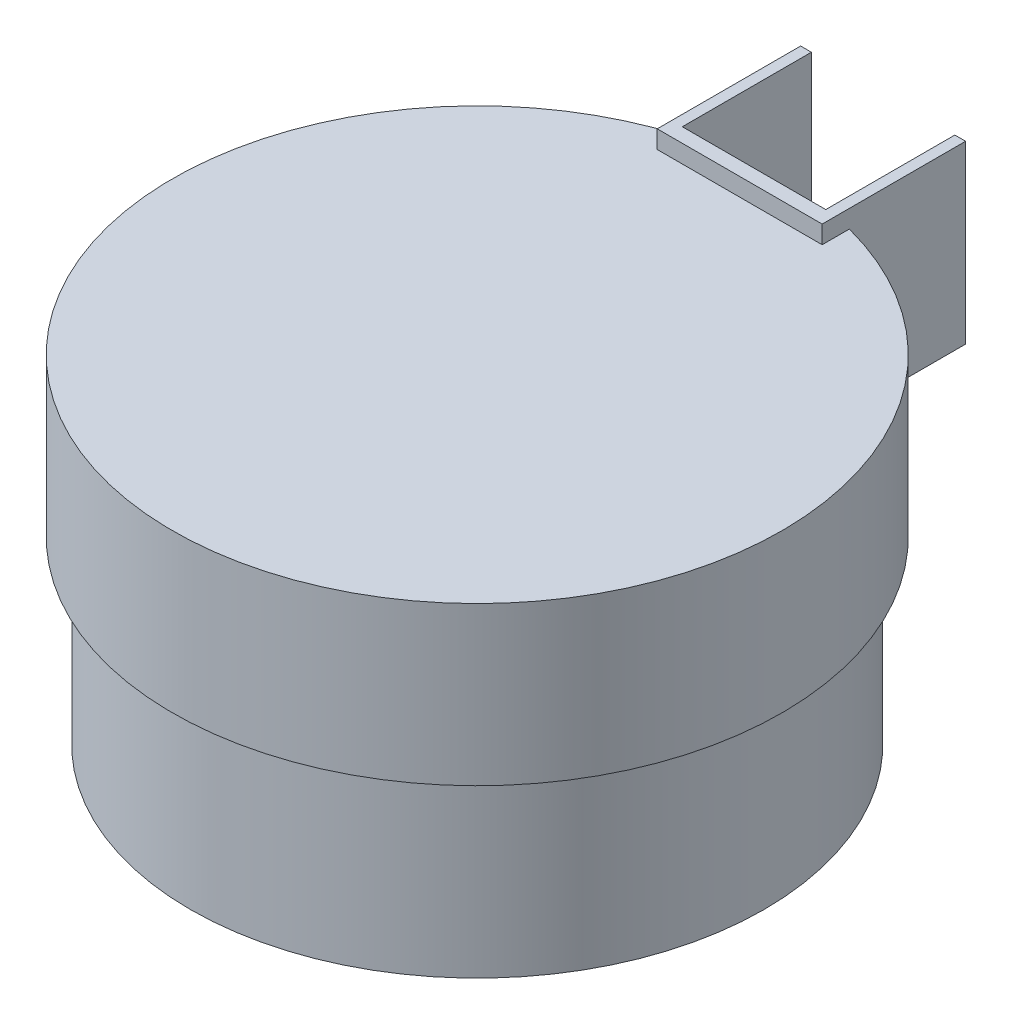
ISO-10303-21;
HEADER;
FILE_DESCRIPTION(('STEP AP214'),'2;1');
FILE_NAME('part.step','',(''),(''),'','','');
FILE_SCHEMA(('AUTOMOTIVE_DESIGN { 1 0 10303 214 1 1 1 1 }'));
ENDSEC;
DATA;
#1=APPLICATION_CONTEXT('core data for automotive mechanical design processes');
#2=APPLICATION_PROTOCOL_DEFINITION('international standard','automotive_design',2000,#1);
#3=PRODUCT_CONTEXT('',#1,'mechanical');
#4=PRODUCT('Part','Part','',(#3));
#5=PRODUCT_RELATED_PRODUCT_CATEGORY('part','',(#4));
#6=PRODUCT_DEFINITION_FORMATION('','',#4);
#7=PRODUCT_DEFINITION_CONTEXT('part definition',#1,'design');
#8=PRODUCT_DEFINITION('design','',#6,#7);
#9=PRODUCT_DEFINITION_SHAPE('','',#8);
#10=(LENGTH_UNIT() NAMED_UNIT(*) SI_UNIT(.MILLI.,.METRE.));
#11=(NAMED_UNIT(*) PLANE_ANGLE_UNIT() SI_UNIT($,.RADIAN.));
#12=(NAMED_UNIT(*) SI_UNIT($,.STERADIAN.) SOLID_ANGLE_UNIT());
#13=UNCERTAINTY_MEASURE_WITH_UNIT(LENGTH_MEASURE(1.E-05),#10,'distance_accuracy_value','');
#14=(GEOMETRIC_REPRESENTATION_CONTEXT(3) GLOBAL_UNCERTAINTY_ASSIGNED_CONTEXT((#13)) GLOBAL_UNIT_ASSIGNED_CONTEXT((#10,
#11,#12)) REPRESENTATION_CONTEXT('',''));
#15=CARTESIAN_POINT('',(0.,0.,0.));
#16=DIRECTION('',(0.,0.,1.));
#17=DIRECTION('',(1.,0.,0.));
#18=AXIS2_PLACEMENT_3D('',#15,#16,#17);
#19=CARTESIAN_POINT('',(10.7705306910649,69.,-57.3248068802023));
#20=DIRECTION('',(0.,0.,1.));
#21=DIRECTION('',(1.,0.,0.));
#22=AXIS2_PLACEMENT_3D('',#19,#20,#21);
#23=PLANE('',#22);
#24=DIRECTION('',(-1.,0.,0.));
#25=VECTOR('',#24,1.);
#26=CARTESIAN_POINT('',(10.7705306910649,25.,-57.3248068802023));
#27=LINE('',#26,#25);
#28=CARTESIAN_POINT('',(10.7705306910649,25.,-57.3248068802023));
#29=VERTEX_POINT('',#28);
#30=CARTESIAN_POINT('',(9.27053069106487,25.,-57.3248068802023));
#31=VERTEX_POINT('',#30);
#32=EDGE_CURVE('E170',#29,#31,#27,.T.);
#33=ORIENTED_EDGE('',*,*,#32,.T.);
#34=DIRECTION('',(0.,1.,0.));
#35=VECTOR('',#34,1.);
#36=CARTESIAN_POINT('',(9.27053069106487,10.5,-57.3248068802023));
#37=LINE('',#36,#35);
#38=CARTESIAN_POINT('',(9.27053069106487,49.5,-57.3248068802023));
#39=VERTEX_POINT('',#38);
#40=EDGE_CURVE('E145',#31,#39,#37,.T.);
#41=ORIENTED_EDGE('',*,*,#40,.T.);
#42=DIRECTION('',(-1.,0.,0.));
#43=VECTOR('',#42,1.);
#44=CARTESIAN_POINT('',(-12.2294693089351,49.5,-57.3248068802023));
#45=LINE('',#44,#43);
#46=CARTESIAN_POINT('',(10.7705306910649,49.5,-57.3248068802023));
#47=VERTEX_POINT('',#46);
#48=EDGE_CURVE('E160',#47,#39,#45,.T.);
#49=ORIENTED_EDGE('',*,*,#48,.F.);
#50=DIRECTION('',(0.,-1.,0.));
#51=VECTOR('',#50,1.);
#52=CARTESIAN_POINT('',(10.7705306910649,69.,-57.3248068802023));
#53=LINE('',#52,#51);
#54=EDGE_CURVE('E176',#47,#29,#53,.T.);
#55=ORIENTED_EDGE('',*,*,#54,.T.);
#56=EDGE_LOOP('',(#33,#41,#49,#55));
#57=FACE_BOUND('',#56,.T.);
#58=ADVANCED_FACE('F46',(#57),#23,.F.);
#59=CARTESIAN_POINT('',(0.,47.,0.));
#60=DIRECTION('',(0.,-1.,0.));
#61=DIRECTION('',(0.,0.,-1.));
#62=AXIS2_PLACEMENT_3D('',#59,#60,#61);
#63=CYLINDRICAL_SURFACE('',#62,42.5);
#64=DIRECTION('',(0.,-1.,0.));
#65=VECTOR('',#64,1.);
#66=CARTESIAN_POINT('',(-12.2294693089351,47.,-40.7024579162219));
#67=LINE('',#66,#65);
#68=CARTESIAN_POINT('',(-12.2294693089351,25.,-40.7024579162219));
#69=VERTEX_POINT('',#68);
#70=CARTESIAN_POINT('',(-12.2294693089351,47.,-40.7024579162219));
#71=VERTEX_POINT('',#70);
#72=EDGE_CURVE('E193',#69,#71,#67,.F.);
#73=ORIENTED_EDGE('',*,*,#72,.F.);
#74=CARTESIAN_POINT('',(0.,25.,0.));
#75=DIRECTION('',(0.,1.,0.));
#76=DIRECTION('',(0.,0.,1.));
#77=AXIS2_PLACEMENT_3D('',#74,#75,#76);
#78=CIRCLE('',#77,42.5);
#79=CARTESIAN_POINT('',(10.7705306910649,25.,-41.1125974444918));
#80=VERTEX_POINT('',#79);
#81=EDGE_CURVE('E50',#69,#80,#78,.T.);
#82=ORIENTED_EDGE('',*,*,#81,.T.);
#83=DIRECTION('',(0.,-1.,0.));
#84=VECTOR('',#83,1.);
#85=CARTESIAN_POINT('',(10.7705306910649,47.,-41.1125974444918));
#86=LINE('',#85,#84);
#87=CARTESIAN_POINT('',(10.7705306910649,47.,-41.1125974444918));
#88=VERTEX_POINT('',#87);
#89=EDGE_CURVE('E185',#88,#80,#86,.T.);
#90=ORIENTED_EDGE('',*,*,#89,.F.);
#91=CARTESIAN_POINT('',(0.,47.,0.));
#92=DIRECTION('',(0.,1.,0.));
#93=DIRECTION('',(0.,0.,1.));
#94=AXIS2_PLACEMENT_3D('',#91,#92,#93);
#95=CIRCLE('',#94,42.5);
#96=EDGE_CURVE('E12',#71,#88,#95,.T.);
#97=ORIENTED_EDGE('',*,*,#96,.F.);
#98=EDGE_LOOP('',(#73,#82,#90,#97));
#99=FACE_BOUND('',#98,.T.);
#100=ADVANCED_FACE('F48',(#99),#63,.T.);
#101=CARTESIAN_POINT('',(0.,47.,0.));
#102=DIRECTION('',(0.,1.,0.));
#103=DIRECTION('',(0.,0.,1.));
#104=AXIS2_PLACEMENT_3D('',#101,#102,#103);
#105=PLANE('',#104);
#106=DIRECTION('',(-1.,0.,0.));
#107=VECTOR('',#106,1.);
#108=CARTESIAN_POINT('',(0.,47.,-37.3248068802023));
#109=LINE('',#108,#107);
#110=CARTESIAN_POINT('',(10.7705306910649,47.,-37.3248068802023));
#111=VERTEX_POINT('',#110);
#112=CARTESIAN_POINT('',(-12.2294693089351,47.,-37.3248068802023));
#113=VERTEX_POINT('',#112);
#114=EDGE_CURVE('E187',#111,#113,#109,.T.);
#115=ORIENTED_EDGE('',*,*,#114,.T.);
#116=DIRECTION('',(0.,0.,-1.));
#117=VECTOR('',#116,1.);
#118=CARTESIAN_POINT('',(-12.2294693089351,47.,0.));
#119=LINE('',#118,#117);
#120=EDGE_CURVE('E190',#113,#71,#119,.T.);
#121=ORIENTED_EDGE('',*,*,#120,.T.);
#122=ORIENTED_EDGE('',*,*,#96,.T.);
#123=DIRECTION('',(0.,0.,1.));
#124=VECTOR('',#123,1.);
#125=CARTESIAN_POINT('',(10.7705306910649,47.,0.));
#126=LINE('',#125,#124);
#127=EDGE_CURVE('E182',#88,#111,#126,.T.);
#128=ORIENTED_EDGE('',*,*,#127,.T.);
#129=EDGE_LOOP('',(#115,#121,#122,#128));
#130=FACE_BOUND('',#129,.T.);
#131=ADVANCED_FACE('F214',(#130),#105,.T.);
#132=CARTESIAN_POINT('',(0.,25.,0.));
#133=DIRECTION('',(0.,1.,0.));
#134=DIRECTION('',(0.,0.,1.));
#135=AXIS2_PLACEMENT_3D('',#132,#133,#134);
#136=PLANE('',#135);
#137=DIRECTION('',(1.,0.,0.));
#138=VECTOR('',#137,1.);
#139=CARTESIAN_POINT('',(0.,25.,-39.3248068802023));
#140=LINE('',#139,#138);
#141=CARTESIAN_POINT('',(-10.7294693089351,25.,-39.3248068802023));
#142=VERTEX_POINT('',#141);
#143=CARTESIAN_POINT('',(9.27053069106487,25.,-39.3248068802023));
#144=VERTEX_POINT('',#143);
#145=EDGE_CURVE('E132',#142,#144,#140,.T.);
#146=ORIENTED_EDGE('',*,*,#145,.T.);
#147=DIRECTION('',(0.,0.,-1.));
#148=VECTOR('',#147,1.);
#149=CARTESIAN_POINT('',(9.27053069106487,25.,0.));
#150=LINE('',#149,#148);
#151=EDGE_CURVE('E153',#144,#31,#150,.T.);
#152=ORIENTED_EDGE('',*,*,#151,.T.);
#153=ORIENTED_EDGE('',*,*,#32,.F.);
#154=DIRECTION('',(0.,0.,-1.));
#155=VECTOR('',#154,1.);
#156=CARTESIAN_POINT('',(10.7705306910649,25.,-37.3248068802023));
#157=LINE('',#156,#155);
#158=EDGE_CURVE('E166',#80,#29,#157,.T.);
#159=ORIENTED_EDGE('',*,*,#158,.F.);
#160=ORIENTED_EDGE('',*,*,#81,.F.);
#161=DIRECTION('',(0.,0.,1.));
#162=VECTOR('',#161,1.);
#163=CARTESIAN_POINT('',(-12.2294693089351,25.,-57.3248068802023));
#164=LINE('',#163,#162);
#165=CARTESIAN_POINT('',(-12.2294693089351,25.,-57.3248068802023));
#166=VERTEX_POINT('',#165);
#167=EDGE_CURVE('E164',#166,#69,#164,.T.);
#168=ORIENTED_EDGE('',*,*,#167,.F.);
#169=CARTESIAN_POINT('',(-10.7294693089351,25.,-57.3248068802023));
#170=VERTEX_POINT('',#169);
#171=EDGE_CURVE('E169',#170,#166,#27,.T.);
#172=ORIENTED_EDGE('',*,*,#171,.F.);
#173=DIRECTION('',(0.,0.,1.));
#174=VECTOR('',#173,1.);
#175=CARTESIAN_POINT('',(-10.7294693089351,25.,0.));
#176=LINE('',#175,#174);
#177=EDGE_CURVE('E148',#170,#142,#176,.T.);
#178=ORIENTED_EDGE('',*,*,#177,.T.);
#179=EDGE_LOOP('',(#146,#152,#153,#159,#160,#168,#172,#178));
#180=FACE_BOUND('',#179,.T.);
#181=ADVANCED_FACE('F205',(#180),#136,.F.);
#182=CARTESIAN_POINT('',(-12.2294693089351,69.,-57.3248068802023));
#183=DIRECTION('',(1.,0.,0.));
#184=DIRECTION('',(0.,0.,-1.));
#185=AXIS2_PLACEMENT_3D('',#182,#183,#184);
#186=PLANE('',#185);
#187=DIRECTION('',(0.,-1.,0.));
#188=VECTOR('',#187,1.);
#189=CARTESIAN_POINT('',(-12.2294693089351,69.,-37.3248068802023));
#190=LINE('',#189,#188);
#191=CARTESIAN_POINT('',(-12.2294693089351,49.5,-37.3248068802023));
#192=VERTEX_POINT('',#191);
#193=EDGE_CURVE('E180',#192,#113,#190,.T.);
#194=ORIENTED_EDGE('',*,*,#193,.F.);
#195=DIRECTION('',(0.,0.,1.));
#196=VECTOR('',#195,1.);
#197=CARTESIAN_POINT('',(-12.2294693089351,49.5,-37.3248068802023));
#198=LINE('',#197,#196);
#199=CARTESIAN_POINT('',(-12.2294693089351,49.5,-57.3248068802023));
#200=VERTEX_POINT('',#199);
#201=EDGE_CURVE('E162',#200,#192,#198,.T.);
#202=ORIENTED_EDGE('',*,*,#201,.F.);
#203=DIRECTION('',(0.,-1.,0.));
#204=VECTOR('',#203,1.);
#205=CARTESIAN_POINT('',(-12.2294693089351,69.,-57.3248068802023));
#206=LINE('',#205,#204);
#207=EDGE_CURVE('E173',#200,#166,#206,.T.);
#208=ORIENTED_EDGE('',*,*,#207,.T.);
#209=ORIENTED_EDGE('',*,*,#167,.T.);
#210=ORIENTED_EDGE('',*,*,#72,.T.);
#211=ORIENTED_EDGE('',*,*,#120,.F.);
#212=EDGE_LOOP('',(#194,#202,#208,#209,#210,#211));
#213=FACE_BOUND('',#212,.T.);
#214=ADVANCED_FACE('F216',(#213),#186,.F.);
#215=CARTESIAN_POINT('',(10.7705306910649,69.,-37.3248068802023));
#216=DIRECTION('',(-1.,0.,0.));
#217=DIRECTION('',(0.,0.,1.));
#218=AXIS2_PLACEMENT_3D('',#215,#216,#217);
#219=PLANE('',#218);
#220=ORIENTED_EDGE('',*,*,#54,.F.);
#221=DIRECTION('',(0.,0.,-1.));
#222=VECTOR('',#221,1.);
#223=CARTESIAN_POINT('',(10.7705306910649,49.5,-57.3248068802023));
#224=LINE('',#223,#222);
#225=CARTESIAN_POINT('',(10.7705306910649,49.5,-37.3248068802023));
#226=VERTEX_POINT('',#225);
#227=EDGE_CURVE('E69',#226,#47,#224,.T.);
#228=ORIENTED_EDGE('',*,*,#227,.F.);
#229=DIRECTION('',(0.,-1.,0.));
#230=VECTOR('',#229,1.);
#231=CARTESIAN_POINT('',(10.7705306910649,69.,-37.3248068802023));
#232=LINE('',#231,#230);
#233=EDGE_CURVE('E178',#226,#111,#232,.T.);
#234=ORIENTED_EDGE('',*,*,#233,.T.);
#235=ORIENTED_EDGE('',*,*,#127,.F.);
#236=ORIENTED_EDGE('',*,*,#89,.T.);
#237=ORIENTED_EDGE('',*,*,#158,.T.);
#238=EDGE_LOOP('',(#220,#228,#234,#235,#236,#237));
#239=FACE_BOUND('',#238,.T.);
#240=ADVANCED_FACE('F210',(#239),#219,.F.);
#241=CARTESIAN_POINT('',(-12.2294693089351,69.,-37.3248068802023));
#242=DIRECTION('',(0.,0.,-1.));
#243=DIRECTION('',(-1.,0.,0.));
#244=AXIS2_PLACEMENT_3D('',#241,#242,#243);
#245=PLANE('',#244);
#246=ORIENTED_EDGE('',*,*,#233,.F.);
#247=DIRECTION('',(1.,0.,0.));
#248=VECTOR('',#247,1.);
#249=CARTESIAN_POINT('',(10.7705306910649,49.5,-37.3248068802023));
#250=LINE('',#249,#248);
#251=EDGE_CURVE('E156',#192,#226,#250,.T.);
#252=ORIENTED_EDGE('',*,*,#251,.F.);
#253=ORIENTED_EDGE('',*,*,#193,.T.);
#254=ORIENTED_EDGE('',*,*,#114,.F.);
#255=EDGE_LOOP('',(#246,#252,#253,#254));
#256=FACE_BOUND('',#255,.T.);
#257=ADVANCED_FACE('F221',(#256),#245,.F.);
#258=CARTESIAN_POINT('',(-10.7294693089351,49.5,-57.3248068802023));
#259=VERTEX_POINT('',#258);
#260=EDGE_CURVE('E159',#259,#200,#45,.T.);
#261=ORIENTED_EDGE('',*,*,#260,.F.);
#262=DIRECTION('',(0.,1.,0.));
#263=VECTOR('',#262,1.);
#264=CARTESIAN_POINT('',(-10.7294693089351,10.5,-57.3248068802023));
#265=LINE('',#264,#263);
#266=EDGE_CURVE('E61',#170,#259,#265,.T.);
#267=ORIENTED_EDGE('',*,*,#266,.F.);
#268=ORIENTED_EDGE('',*,*,#171,.T.);
#269=ORIENTED_EDGE('',*,*,#207,.F.);
#270=EDGE_LOOP('',(#261,#267,#268,#269));
#271=FACE_BOUND('',#270,.T.);
#272=ADVANCED_FACE('F223',(#271),#23,.F.);
#273=CARTESIAN_POINT('',(0.,49.5,0.));
#274=DIRECTION('',(0.,-1.,0.));
#275=DIRECTION('',(0.,0.,-1.));
#276=AXIS2_PLACEMENT_3D('',#273,#274,#275);
#277=PLANE('',#276);
#278=ORIENTED_EDGE('',*,*,#48,.T.);
#279=DIRECTION('',(0.,0.,-1.));
#280=VECTOR('',#279,1.);
#281=CARTESIAN_POINT('',(9.27053069106487,49.5,-39.3248068802023));
#282=LINE('',#281,#280);
#283=CARTESIAN_POINT('',(9.27053069106487,49.5,-39.3248068802023));
#284=VERTEX_POINT('',#283);
#285=EDGE_CURVE('E141',#284,#39,#282,.T.);
#286=ORIENTED_EDGE('',*,*,#285,.F.);
#287=DIRECTION('',(1.,0.,0.));
#288=VECTOR('',#287,1.);
#289=CARTESIAN_POINT('',(-10.7294693089351,49.5,-39.3248068802023));
#290=LINE('',#289,#288);
#291=CARTESIAN_POINT('',(-10.7294693089351,49.5,-39.3248068802023));
#292=VERTEX_POINT('',#291);
#293=EDGE_CURVE('E129',#292,#284,#290,.T.);
#294=ORIENTED_EDGE('',*,*,#293,.F.);
#295=DIRECTION('',(0.,0.,1.));
#296=VECTOR('',#295,1.);
#297=CARTESIAN_POINT('',(-10.7294693089351,49.5,-57.3248068802023));
#298=LINE('',#297,#296);
#299=EDGE_CURVE('E136',#259,#292,#298,.T.);
#300=ORIENTED_EDGE('',*,*,#299,.F.);
#301=ORIENTED_EDGE('',*,*,#260,.T.);
#302=ORIENTED_EDGE('',*,*,#201,.T.);
#303=ORIENTED_EDGE('',*,*,#251,.T.);
#304=ORIENTED_EDGE('',*,*,#227,.T.);
#305=EDGE_LOOP('',(#278,#286,#294,#300,#301,#302,#303,#304));
#306=FACE_BOUND('',#305,.T.);
#307=ADVANCED_FACE('F140',(#306),#277,.F.);
#308=CARTESIAN_POINT('',(9.27053069106487,10.5,-39.3248068802023));
#309=DIRECTION('',(1.,0.,0.));
#310=DIRECTION('',(0.,0.,-1.));
#311=AXIS2_PLACEMENT_3D('',#308,#309,#310);
#312=PLANE('',#311);
#313=DIRECTION('',(0.,1.,0.));
#314=VECTOR('',#313,1.);
#315=CARTESIAN_POINT('',(9.27053069106487,10.5,-39.3248068802023));
#316=LINE('',#315,#314);
#317=EDGE_CURVE('E134',#144,#284,#316,.T.);
#318=ORIENTED_EDGE('',*,*,#317,.T.);
#319=ORIENTED_EDGE('',*,*,#285,.T.);
#320=ORIENTED_EDGE('',*,*,#40,.F.);
#321=ORIENTED_EDGE('',*,*,#151,.F.);
#322=EDGE_LOOP('',(#318,#319,#320,#321));
#323=FACE_BOUND('',#322,.T.);
#324=ADVANCED_FACE('F226',(#323),#312,.F.);
#325=CARTESIAN_POINT('',(-10.7294693089351,10.5,-39.3248068802023));
#326=DIRECTION('',(0.,0.,1.));
#327=DIRECTION('',(1.,0.,0.));
#328=AXIS2_PLACEMENT_3D('',#325,#326,#327);
#329=PLANE('',#328);
#330=DIRECTION('',(0.,1.,0.));
#331=VECTOR('',#330,1.);
#332=CARTESIAN_POINT('',(-10.7294693089351,10.5,-39.3248068802023));
#333=LINE('',#332,#331);
#334=EDGE_CURVE('E125',#142,#292,#333,.T.);
#335=ORIENTED_EDGE('',*,*,#334,.T.);
#336=ORIENTED_EDGE('',*,*,#293,.T.);
#337=ORIENTED_EDGE('',*,*,#317,.F.);
#338=ORIENTED_EDGE('',*,*,#145,.F.);
#339=EDGE_LOOP('',(#335,#336,#337,#338));
#340=FACE_BOUND('',#339,.T.);
#341=ADVANCED_FACE('F126',(#340),#329,.F.);
#342=CARTESIAN_POINT('',(-10.7294693089351,10.5,-57.3248068802023));
#343=DIRECTION('',(-1.,0.,0.));
#344=DIRECTION('',(0.,0.,1.));
#345=AXIS2_PLACEMENT_3D('',#342,#343,#344);
#346=PLANE('',#345);
#347=ORIENTED_EDGE('',*,*,#266,.T.);
#348=ORIENTED_EDGE('',*,*,#299,.T.);
#349=ORIENTED_EDGE('',*,*,#334,.F.);
#350=ORIENTED_EDGE('',*,*,#177,.F.);
#351=EDGE_LOOP('',(#347,#348,#349,#350));
#352=FACE_BOUND('',#351,.T.);
#353=ADVANCED_FACE('F137',(#352),#346,.F.);
#354=CLOSED_SHELL('',(#58,#100,#131,#181,#214,#240,#257,#272,#307,#324,#341,#353));
#355=MANIFOLD_SOLID_BREP('B2',#354);
#356=CARTESIAN_POINT('',(0.,0.,0.));
#357=DIRECTION('',(0.,1.,0.));
#358=DIRECTION('',(0.,0.,1.));
#359=AXIS2_PLACEMENT_3D('',#356,#357,#358);
#360=CYLINDRICAL_SURFACE('',#359,40.);
#361=CARTESIAN_POINT('',(0.,0.,0.));
#362=DIRECTION('',(0.,1.,0.));
#363=DIRECTION('',(0.,0.,1.));
#364=AXIS2_PLACEMENT_3D('',#361,#362,#363);
#365=CIRCLE('',#364,40.);
#366=CARTESIAN_POINT('',(0.,0.,40.));
#367=VERTEX_POINT('',#366);
#368=EDGE_CURVE('E331',#367,#367,#365,.T.);
#369=ORIENTED_EDGE('',*,*,#368,.T.);
#370=EDGE_LOOP('',(#369));
#371=FACE_BOUND('',#370,.T.);
#372=CARTESIAN_POINT('',(0.,25.,0.));
#373=DIRECTION('',(0.,1.,0.));
#374=DIRECTION('',(0.,0.,1.));
#375=AXIS2_PLACEMENT_3D('',#372,#373,#374);
#376=CIRCLE('',#375,40.);
#377=CARTESIAN_POINT('',(0.,25.,40.));
#378=VERTEX_POINT('',#377);
#379=EDGE_CURVE('E45',#378,#378,#376,.T.);
#380=ORIENTED_EDGE('',*,*,#379,.F.);
#381=EDGE_LOOP('',(#380));
#382=FACE_BOUND('',#381,.T.);
#383=ADVANCED_FACE('F325',(#371,#382),#360,.T.);
#384=CARTESIAN_POINT('',(0.,25.,0.));
#385=DIRECTION('',(0.,1.,0.));
#386=DIRECTION('',(0.,0.,1.));
#387=AXIS2_PLACEMENT_3D('',#384,#385,#386);
#388=PLANE('',#387);
#389=ORIENTED_EDGE('',*,*,#379,.T.);
#390=EDGE_LOOP('',(#389));
#391=FACE_BOUND('',#390,.T.);
#392=ADVANCED_FACE('F326',(#391),#388,.T.);
#393=OPEN_SHELL('',(#383,#392));
#394=SHELL_BASED_SURFACE_MODEL('B6',(#393));
#395=ADVANCED_BREP_SHAPE_REPRESENTATION('',(#18,#355),#14);
#396=MANIFOLD_SURFACE_SHAPE_REPRESENTATION('',(#18,#394),#14);
#397=SHAPE_REPRESENTATION('',(#18),#14);
#398=SHAPE_DEFINITION_REPRESENTATION(#9,#397);
#399=SHAPE_REPRESENTATION_RELATIONSHIP('','',#397,#395);
#400=SHAPE_REPRESENTATION_RELATIONSHIP('','',#397,#396);
ENDSEC;
END-ISO-10303-21;
